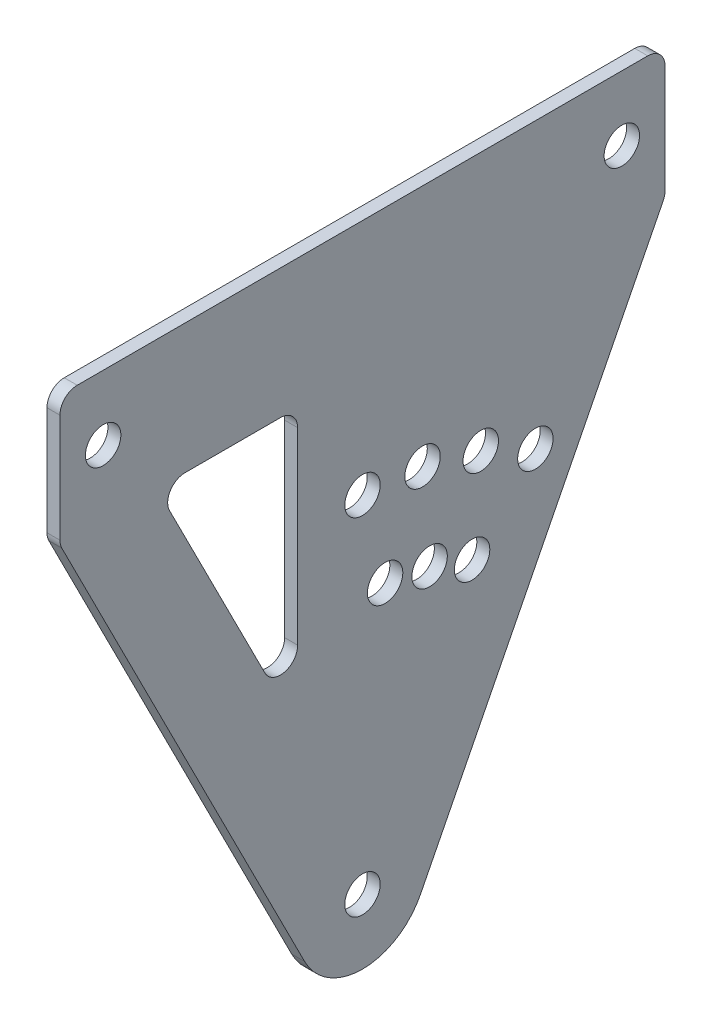
ISO-10303-21;
HEADER;
FILE_DESCRIPTION(('STEP AP214'),'2;1');
FILE_NAME('part.step','',(''),(''),'','','');
FILE_SCHEMA(('AUTOMOTIVE_DESIGN { 1 0 10303 214 1 1 1 1 }'));
ENDSEC;
DATA;
#1=APPLICATION_CONTEXT('core data for automotive mechanical design processes');
#2=APPLICATION_PROTOCOL_DEFINITION('international standard','automotive_design',2000,#1);
#3=PRODUCT_CONTEXT('',#1,'mechanical');
#4=PRODUCT('Part','Part','',(#3));
#5=PRODUCT_RELATED_PRODUCT_CATEGORY('part','',(#4));
#6=PRODUCT_DEFINITION_FORMATION('','',#4);
#7=PRODUCT_DEFINITION_CONTEXT('part definition',#1,'design');
#8=PRODUCT_DEFINITION('design','',#6,#7);
#9=PRODUCT_DEFINITION_SHAPE('','',#8);
#10=(LENGTH_UNIT() NAMED_UNIT(*) SI_UNIT(.MILLI.,.METRE.));
#11=(NAMED_UNIT(*) PLANE_ANGLE_UNIT() SI_UNIT($,.RADIAN.));
#12=(NAMED_UNIT(*) SI_UNIT($,.STERADIAN.) SOLID_ANGLE_UNIT());
#13=UNCERTAINTY_MEASURE_WITH_UNIT(LENGTH_MEASURE(1.E-05),#10,'distance_accuracy_value','');
#14=(GEOMETRIC_REPRESENTATION_CONTEXT(3) GLOBAL_UNCERTAINTY_ASSIGNED_CONTEXT((#13)) GLOBAL_UNIT_ASSIGNED_CONTEXT((#10,
#11,#12)) REPRESENTATION_CONTEXT('',''));
#15=CARTESIAN_POINT('',(0.,0.,0.));
#16=DIRECTION('',(0.,0.,1.));
#17=DIRECTION('',(1.,0.,0.));
#18=AXIS2_PLACEMENT_3D('',#15,#16,#17);
#19=CARTESIAN_POINT('',(1.5,-3.38899914927747,6.69064158105906));
#20=DIRECTION('',(0.,0.451866553236997,-0.892085544141209));
#21=DIRECTION('',(0.,0.892085544141209,0.451866553236997));
#22=AXIS2_PLACEMENT_3D('',#19,#20,#21);
#23=PLANE('',#22);
#24=DIRECTION('',(0.,-0.892085544141209,-0.451866553236997));
#25=VECTOR('',#24,1.);
#26=CARTESIAN_POINT('',(1.5,-3.38899914927747,6.69064158105906));
#27=LINE('',#26,#25);
#28=CARTESIAN_POINT('',(1.5,52.0739055020299,34.7841710882824));
#29=VERTEX_POINT('',#28);
#30=CARTESIAN_POINT('',(1.5,-3.38899914927747,6.69064158105906));
#31=VERTEX_POINT('',#30);
#32=EDGE_CURVE('E156',#29,#31,#27,.T.);
#33=ORIENTED_EDGE('',*,*,#32,.F.);
#34=DIRECTION('',(-1.,0.,0.));
#35=VECTOR('',#34,1.);
#36=CARTESIAN_POINT('',(1.5,52.0739055020299,34.7841710882824));
#37=LINE('',#36,#35);
#38=CARTESIAN_POINT('',(0.,52.0739055020299,34.7841710882824));
#39=VERTEX_POINT('',#38);
#40=EDGE_CURVE('E388',#29,#39,#37,.T.);
#41=ORIENTED_EDGE('',*,*,#40,.T.);
#42=DIRECTION('',(0.,-0.892085544141209,-0.451866553236997));
#43=VECTOR('',#42,1.);
#44=CARTESIAN_POINT('',(0.,-3.38899914927747,6.69064158105906));
#45=LINE('',#44,#43);
#46=CARTESIAN_POINT('',(0.,-3.38899914927747,6.69064158105906));
#47=VERTEX_POINT('',#46);
#48=EDGE_CURVE('E183',#39,#47,#45,.T.);
#49=ORIENTED_EDGE('',*,*,#48,.T.);
#50=DIRECTION('',(-1.,0.,0.));
#51=VECTOR('',#50,1.);
#52=CARTESIAN_POINT('',(1.5,-3.38899914927747,6.69064158105906));
#53=LINE('',#52,#51);
#54=EDGE_CURVE('E176',#31,#47,#53,.T.);
#55=ORIENTED_EDGE('',*,*,#54,.F.);
#56=EDGE_LOOP('',(#33,#41,#49,#55));
#57=FACE_BOUND('',#56,.T.);
#58=ADVANCED_FACE('F42',(#57),#23,.F.);
#59=CARTESIAN_POINT('',(1.5,0.,0.));
#60=DIRECTION('',(-1.,0.,0.));
#61=DIRECTION('',(0.,0.,1.));
#62=AXIS2_PLACEMENT_3D('',#59,#60,#61);
#63=CYLINDRICAL_SURFACE('',#62,7.49999999999999);
#64=CARTESIAN_POINT('',(0.,0.,0.));
#65=DIRECTION('',(1.,0.,0.));
#66=DIRECTION('',(0.,0.,-1.));
#67=AXIS2_PLACEMENT_3D('',#64,#65,#66);
#68=CIRCLE('',#67,7.49999999999999);
#69=CARTESIAN_POINT('',(0.,-3.38899914927747,-6.69064158105906));
#70=VERTEX_POINT('',#69);
#71=EDGE_CURVE('E281',#47,#70,#68,.T.);
#72=ORIENTED_EDGE('',*,*,#71,.T.);
#73=DIRECTION('',(-1.,0.,0.));
#74=VECTOR('',#73,1.);
#75=CARTESIAN_POINT('',(1.5,-3.38899914927747,-6.69064158105906));
#76=LINE('',#75,#74);
#77=CARTESIAN_POINT('',(1.5,-3.38899914927747,-6.69064158105906));
#78=VERTEX_POINT('',#77);
#79=EDGE_CURVE('E178',#78,#70,#76,.T.);
#80=ORIENTED_EDGE('',*,*,#79,.F.);
#81=CARTESIAN_POINT('',(1.5,0.,0.));
#82=DIRECTION('',(1.,0.,0.));
#83=DIRECTION('',(0.,0.,-1.));
#84=AXIS2_PLACEMENT_3D('',#81,#82,#83);
#85=CIRCLE('',#84,7.49999999999999);
#86=EDGE_CURVE('E161',#31,#78,#85,.T.);
#87=ORIENTED_EDGE('',*,*,#86,.F.);
#88=ORIENTED_EDGE('',*,*,#54,.T.);
#89=EDGE_LOOP('',(#72,#80,#87,#88));
#90=FACE_BOUND('',#89,.T.);
#91=ADVANCED_FACE('F175',(#90),#63,.T.);
#92=CARTESIAN_POINT('',(1.5,-3.38899914927747,-6.69064158105906));
#93=DIRECTION('',(0.,-0.451866553236997,-0.892085544141209));
#94=DIRECTION('',(0.,0.892085544141209,-0.451866553236997));
#95=AXIS2_PLACEMENT_3D('',#92,#93,#94);
#96=PLANE('',#95);
#97=DIRECTION('',(0.,-0.892085544141209,0.451866553236997));
#98=VECTOR('',#97,1.);
#99=CARTESIAN_POINT('',(0.,-3.38899914927747,-6.69064158105906));
#100=LINE('',#99,#98);
#101=CARTESIAN_POINT('',(0.,52.0739055020299,-34.7841710882824));
#102=VERTEX_POINT('',#101);
#103=EDGE_CURVE('E283',#102,#70,#100,.T.);
#104=ORIENTED_EDGE('',*,*,#103,.F.);
#105=DIRECTION('',(-1.,0.,0.));
#106=VECTOR('',#105,1.);
#107=CARTESIAN_POINT('',(1.5,52.0739055020299,-34.7841710882824));
#108=LINE('',#107,#106);
#109=CARTESIAN_POINT('',(1.5,52.0739055020299,-34.7841710882824));
#110=VERTEX_POINT('',#109);
#111=EDGE_CURVE('E384',#102,#110,#108,.F.);
#112=ORIENTED_EDGE('',*,*,#111,.T.);
#113=DIRECTION('',(0.,-0.892085544141209,0.451866553236997));
#114=VECTOR('',#113,1.);
#115=CARTESIAN_POINT('',(1.5,-3.38899914927747,-6.69064158105906));
#116=LINE('',#115,#114);
#117=EDGE_CURVE('E180',#110,#78,#116,.T.);
#118=ORIENTED_EDGE('',*,*,#117,.T.);
#119=ORIENTED_EDGE('',*,*,#79,.T.);
#120=EDGE_LOOP('',(#104,#112,#118,#119));
#121=FACE_BOUND('',#120,.T.);
#122=ADVANCED_FACE('F448',(#121),#96,.T.);
#123=CARTESIAN_POINT('',(1.5,0.,-35.));
#124=DIRECTION('',(0.,0.,-1.));
#125=DIRECTION('',(-1.,0.,0.));
#126=AXIS2_PLACEMENT_3D('',#123,#124,#125);
#127=PLANE('',#126);
#128=DIRECTION('',(0.,-1.,0.));
#129=VECTOR('',#128,1.);
#130=CARTESIAN_POINT('',(0.,0.,-35.));
#131=LINE('',#130,#129);
#132=CARTESIAN_POINT('',(0.,65.5,-35.));
#133=VERTEX_POINT('',#132);
#134=CARTESIAN_POINT('',(0.,52.9776386085039,-35.));
#135=VERTEX_POINT('',#134);
#136=EDGE_CURVE('E285',#133,#135,#131,.T.);
#137=ORIENTED_EDGE('',*,*,#136,.F.);
#138=DIRECTION('',(-1.,0.,0.));
#139=VECTOR('',#138,1.);
#140=CARTESIAN_POINT('',(1.5,65.5,-35.));
#141=LINE('',#140,#139);
#142=CARTESIAN_POINT('',(1.5,65.5,-35.));
#143=VERTEX_POINT('',#142);
#144=EDGE_CURVE('E221',#133,#143,#141,.F.);
#145=ORIENTED_EDGE('',*,*,#144,.T.);
#146=DIRECTION('',(0.,-1.,0.));
#147=VECTOR('',#146,1.);
#148=CARTESIAN_POINT('',(1.5,0.,-35.));
#149=LINE('',#148,#147);
#150=CARTESIAN_POINT('',(1.5,52.9776386085039,-35.));
#151=VERTEX_POINT('',#150);
#152=EDGE_CURVE('E375',#143,#151,#149,.T.);
#153=ORIENTED_EDGE('',*,*,#152,.T.);
#154=DIRECTION('',(-1.,0.,0.));
#155=VECTOR('',#154,1.);
#156=CARTESIAN_POINT('',(1.5,52.9776386085039,-35.));
#157=LINE('',#156,#155);
#158=EDGE_CURVE('E218',#151,#135,#157,.T.);
#159=ORIENTED_EDGE('',*,*,#158,.T.);
#160=EDGE_LOOP('',(#137,#145,#153,#159));
#161=FACE_BOUND('',#160,.T.);
#162=ADVANCED_FACE('F439',(#161),#127,.T.);
#163=CARTESIAN_POINT('',(1.5,67.5,0.));
#164=DIRECTION('',(0.,1.,0.));
#165=DIRECTION('',(0.,0.,1.));
#166=AXIS2_PLACEMENT_3D('',#163,#164,#165);
#167=PLANE('',#166);
#168=DIRECTION('',(0.,0.,-1.));
#169=VECTOR('',#168,1.);
#170=CARTESIAN_POINT('',(1.5,67.5,0.));
#171=LINE('',#170,#169);
#172=CARTESIAN_POINT('',(1.5,67.5,33.));
#173=VERTEX_POINT('',#172);
#174=CARTESIAN_POINT('',(1.5,67.5,-33.));
#175=VERTEX_POINT('',#174);
#176=EDGE_CURVE('E238',#173,#175,#171,.T.);
#177=ORIENTED_EDGE('',*,*,#176,.T.);
#178=DIRECTION('',(-1.,0.,0.));
#179=VECTOR('',#178,1.);
#180=CARTESIAN_POINT('',(1.5,67.5,-33.));
#181=LINE('',#180,#179);
#182=CARTESIAN_POINT('',(0.,67.5,-33.));
#183=VERTEX_POINT('',#182);
#184=EDGE_CURVE('E207',#175,#183,#181,.T.);
#185=ORIENTED_EDGE('',*,*,#184,.T.);
#186=DIRECTION('',(0.,0.,-1.));
#187=VECTOR('',#186,1.);
#188=CARTESIAN_POINT('',(0.,67.5,0.));
#189=LINE('',#188,#187);
#190=CARTESIAN_POINT('',(0.,67.5,33.));
#191=VERTEX_POINT('',#190);
#192=EDGE_CURVE('E288',#191,#183,#189,.T.);
#193=ORIENTED_EDGE('',*,*,#192,.F.);
#194=DIRECTION('',(-1.,0.,0.));
#195=VECTOR('',#194,1.);
#196=CARTESIAN_POINT('',(1.5,67.5,33.));
#197=LINE('',#196,#195);
#198=EDGE_CURVE('E205',#191,#173,#197,.F.);
#199=ORIENTED_EDGE('',*,*,#198,.T.);
#200=EDGE_LOOP('',(#177,#185,#193,#199));
#201=FACE_BOUND('',#200,.T.);
#202=ADVANCED_FACE('F431',(#201),#167,.T.);
#203=CARTESIAN_POINT('',(1.5,52.5,0.));
#204=DIRECTION('',(0.,-1.,0.));
#205=DIRECTION('',(0.,0.,-1.));
#206=AXIS2_PLACEMENT_3D('',#203,#204,#205);
#207=PLANE('',#206);
#208=DIRECTION('',(0.,0.,1.));
#209=VECTOR('',#208,1.);
#210=CARTESIAN_POINT('',(0.,52.5,0.));
#211=LINE('',#210,#209);
#212=CARTESIAN_POINT('',(0.,52.5,9.5));
#213=VERTEX_POINT('',#212);
#214=CARTESIAN_POINT('',(0.,52.5,20.535318679672));
#215=VERTEX_POINT('',#214);
#216=EDGE_CURVE('E241',#213,#215,#211,.T.);
#217=ORIENTED_EDGE('',*,*,#216,.F.);
#218=DIRECTION('',(-1.,0.,0.));
#219=VECTOR('',#218,1.);
#220=CARTESIAN_POINT('',(1.5,52.5,9.5));
#221=LINE('',#220,#219);
#222=CARTESIAN_POINT('',(1.5,52.5,9.5));
#223=VERTEX_POINT('',#222);
#224=EDGE_CURVE('E198',#213,#223,#221,.F.);
#225=ORIENTED_EDGE('',*,*,#224,.T.);
#226=DIRECTION('',(0.,0.,1.));
#227=VECTOR('',#226,1.);
#228=CARTESIAN_POINT('',(1.5,52.5,0.));
#229=LINE('',#228,#227);
#230=CARTESIAN_POINT('',(1.5,52.5,20.535318679672));
#231=VERTEX_POINT('',#230);
#232=EDGE_CURVE('E291',#223,#231,#229,.T.);
#233=ORIENTED_EDGE('',*,*,#232,.T.);
#234=DIRECTION('',(-1.,0.,0.));
#235=VECTOR('',#234,1.);
#236=CARTESIAN_POINT('',(0.,52.5,20.535318679672));
#237=LINE('',#236,#235);
#238=EDGE_CURVE('E195',#231,#215,#237,.T.);
#239=ORIENTED_EDGE('',*,*,#238,.T.);
#240=EDGE_LOOP('',(#217,#225,#233,#239));
#241=FACE_BOUND('',#240,.T.);
#242=ADVANCED_FACE('F429',(#241),#207,.T.);
#243=CARTESIAN_POINT('',(1.5,0.,7.49999999999998));
#244=DIRECTION('',(0.,0.,-1.));
#245=DIRECTION('',(0.,1.,0.));
#246=AXIS2_PLACEMENT_3D('',#243,#244,#245);
#247=PLANE('',#246);
#248=DIRECTION('',(0.,-1.,0.));
#249=VECTOR('',#248,1.);
#250=CARTESIAN_POINT('',(1.5,0.,7.49999999999998));
#251=LINE('',#250,#249);
#252=CARTESIAN_POINT('',(1.5,50.5,7.5));
#253=VERTEX_POINT('',#252);
#254=CARTESIAN_POINT('',(1.5,28.7138151217322,7.49999999999999));
#255=VERTEX_POINT('',#254);
#256=EDGE_CURVE('E296',#253,#255,#251,.T.);
#257=ORIENTED_EDGE('',*,*,#256,.F.);
#258=DIRECTION('',(-1.,0.,0.));
#259=VECTOR('',#258,1.);
#260=CARTESIAN_POINT('',(1.5,50.5,7.5));
#261=LINE('',#260,#259);
#262=CARTESIAN_POINT('',(0.,50.5,7.5));
#263=VERTEX_POINT('',#262);
#264=EDGE_CURVE('E187',#253,#263,#261,.T.);
#265=ORIENTED_EDGE('',*,*,#264,.T.);
#266=DIRECTION('',(0.,-1.,0.));
#267=VECTOR('',#266,1.);
#268=CARTESIAN_POINT('',(0.,0.,7.49999999999998));
#269=LINE('',#268,#267);
#270=CARTESIAN_POINT('',(0.,28.7138151217322,7.49999999999999));
#271=VERTEX_POINT('',#270);
#272=EDGE_CURVE('E244',#263,#271,#269,.T.);
#273=ORIENTED_EDGE('',*,*,#272,.T.);
#274=DIRECTION('',(-1.,0.,0.));
#275=VECTOR('',#274,1.);
#276=CARTESIAN_POINT('',(1.5,28.7138151217322,7.49999999999999));
#277=LINE('',#276,#275);
#278=EDGE_CURVE('E185',#271,#255,#277,.F.);
#279=ORIENTED_EDGE('',*,*,#278,.T.);
#280=EDGE_LOOP('',(#257,#265,#273,#279));
#281=FACE_BOUND('',#280,.T.);
#282=ADVANCED_FACE('F424',(#281),#247,.F.);
#283=CARTESIAN_POINT('',(1.5,0.,0.));
#284=DIRECTION('',(-1.,0.,0.));
#285=DIRECTION('',(0.,0.,1.));
#286=AXIS2_PLACEMENT_3D('',#283,#284,#285);
#287=CYLINDRICAL_SURFACE('',#286,2.05);
#288=CARTESIAN_POINT('',(1.5,0.,0.));
#289=DIRECTION('',(1.,0.,0.));
#290=DIRECTION('',(0.,0.,-1.));
#291=AXIS2_PLACEMENT_3D('',#288,#289,#290);
#292=CIRCLE('',#291,2.05);
#293=CARTESIAN_POINT('',(1.5,0.,-2.05));
#294=VERTEX_POINT('',#293);
#295=EDGE_CURVE('E170',#294,#294,#292,.T.);
#296=ORIENTED_EDGE('',*,*,#295,.T.);
#297=EDGE_LOOP('',(#296));
#298=FACE_BOUND('',#297,.T.);
#299=CARTESIAN_POINT('',(0.,0.,0.));
#300=DIRECTION('',(1.,0.,0.));
#301=DIRECTION('',(0.,0.,-1.));
#302=AXIS2_PLACEMENT_3D('',#299,#300,#301);
#303=CIRCLE('',#302,2.05);
#304=CARTESIAN_POINT('',(0.,0.,-2.05));
#305=VERTEX_POINT('',#304);
#306=EDGE_CURVE('E277',#305,#305,#303,.T.);
#307=ORIENTED_EDGE('',*,*,#306,.F.);
#308=EDGE_LOOP('',(#307));
#309=FACE_BOUND('',#308,.T.);
#310=ADVANCED_FACE('F437',(#298,#309),#287,.F.);
#311=CARTESIAN_POINT('',(1.5,40.,0.));
#312=DIRECTION('',(-1.,0.,0.));
#313=DIRECTION('',(0.,0.,1.));
#314=AXIS2_PLACEMENT_3D('',#311,#312,#313);
#315=CYLINDRICAL_SURFACE('',#314,2.05);
#316=CARTESIAN_POINT('',(1.5,40.,0.));
#317=DIRECTION('',(1.,0.,0.));
#318=DIRECTION('',(0.,0.,-1.));
#319=AXIS2_PLACEMENT_3D('',#316,#317,#318);
#320=CIRCLE('',#319,2.05);
#321=CARTESIAN_POINT('',(1.5,40.,-2.05));
#322=VERTEX_POINT('',#321);
#323=EDGE_CURVE('E362',#322,#322,#320,.T.);
#324=ORIENTED_EDGE('',*,*,#323,.T.);
#325=EDGE_LOOP('',(#324));
#326=FACE_BOUND('',#325,.T.);
#327=CARTESIAN_POINT('',(0.,40.,0.));
#328=DIRECTION('',(1.,0.,0.));
#329=DIRECTION('',(0.,0.,-1.));
#330=AXIS2_PLACEMENT_3D('',#327,#328,#329);
#331=CIRCLE('',#330,2.05);
#332=CARTESIAN_POINT('',(0.,40.,-2.05));
#333=VERTEX_POINT('',#332);
#334=EDGE_CURVE('E274',#333,#333,#331,.T.);
#335=ORIENTED_EDGE('',*,*,#334,.F.);
#336=EDGE_LOOP('',(#335));
#337=FACE_BOUND('',#336,.T.);
#338=ADVANCED_FACE('F454',(#326,#337),#315,.F.);
#339=CARTESIAN_POINT('',(1.5,39.3923101204883,-6.94592710667722));
#340=DIRECTION('',(-1.,0.,0.));
#341=DIRECTION('',(0.,0.,1.));
#342=AXIS2_PLACEMENT_3D('',#339,#340,#341);
#343=CYLINDRICAL_SURFACE('',#342,2.05000000000001);
#344=CARTESIAN_POINT('',(1.5,39.3923101204883,-6.94592710667722));
#345=DIRECTION('',(1.,0.,0.));
#346=DIRECTION('',(0.,0.,-1.));
#347=AXIS2_PLACEMENT_3D('',#344,#345,#346);
#348=CIRCLE('',#347,2.05000000000001);
#349=CARTESIAN_POINT('',(1.5,39.3923101204883,-8.99592710667723));
#350=VERTEX_POINT('',#349);
#351=EDGE_CURVE('E354',#350,#350,#348,.T.);
#352=ORIENTED_EDGE('',*,*,#351,.T.);
#353=EDGE_LOOP('',(#352));
#354=FACE_BOUND('',#353,.T.);
#355=CARTESIAN_POINT('',(0.,39.3923101204883,-6.94592710667722));
#356=DIRECTION('',(1.,0.,0.));
#357=DIRECTION('',(0.,0.,-1.));
#358=AXIS2_PLACEMENT_3D('',#355,#356,#357);
#359=CIRCLE('',#358,2.05000000000001);
#360=CARTESIAN_POINT('',(0.,39.3923101204883,-8.99592710667723));
#361=VERTEX_POINT('',#360);
#362=EDGE_CURVE('E271',#361,#361,#359,.T.);
#363=ORIENTED_EDGE('',*,*,#362,.F.);
#364=EDGE_LOOP('',(#363));
#365=FACE_BOUND('',#364,.T.);
#366=ADVANCED_FACE('F458',(#354,#365),#343,.F.);
#367=CARTESIAN_POINT('',(1.5,37.5877048314363,-13.6808057330268));
#368=DIRECTION('',(-1.,0.,0.));
#369=DIRECTION('',(0.,0.,1.));
#370=AXIS2_PLACEMENT_3D('',#367,#368,#369);
#371=CYLINDRICAL_SURFACE('',#370,2.05);
#372=CARTESIAN_POINT('',(1.5,37.5877048314363,-13.6808057330268));
#373=DIRECTION('',(1.,0.,0.));
#374=DIRECTION('',(0.,0.,-1.));
#375=AXIS2_PLACEMENT_3D('',#372,#373,#374);
#376=CIRCLE('',#375,2.05);
#377=CARTESIAN_POINT('',(1.5,37.5877048314363,-15.7308057330268));
#378=VERTEX_POINT('',#377);
#379=EDGE_CURVE('E349',#378,#378,#376,.T.);
#380=ORIENTED_EDGE('',*,*,#379,.T.);
#381=EDGE_LOOP('',(#380));
#382=FACE_BOUND('',#381,.T.);
#383=CARTESIAN_POINT('',(0.,37.5877048314363,-13.6808057330268));
#384=DIRECTION('',(1.,0.,0.));
#385=DIRECTION('',(0.,0.,-1.));
#386=AXIS2_PLACEMENT_3D('',#383,#384,#385);
#387=CIRCLE('',#386,2.05);
#388=CARTESIAN_POINT('',(0.,37.5877048314363,-15.7308057330268));
#389=VERTEX_POINT('',#388);
#390=EDGE_CURVE('E268',#389,#389,#387,.T.);
#391=ORIENTED_EDGE('',*,*,#390,.F.);
#392=EDGE_LOOP('',(#391));
#393=FACE_BOUND('',#392,.T.);
#394=ADVANCED_FACE('F462',(#382,#393),#371,.F.);
#395=CARTESIAN_POINT('',(1.5,34.6410161513775,-20.));
#396=DIRECTION('',(-1.,0.,0.));
#397=DIRECTION('',(0.,0.,1.));
#398=AXIS2_PLACEMENT_3D('',#395,#396,#397);
#399=CYLINDRICAL_SURFACE('',#398,2.05);
#400=CARTESIAN_POINT('',(1.5,34.6410161513775,-20.));
#401=DIRECTION('',(1.,0.,0.));
#402=DIRECTION('',(0.,0.,-1.));
#403=AXIS2_PLACEMENT_3D('',#400,#401,#402);
#404=CIRCLE('',#403,2.05);
#405=CARTESIAN_POINT('',(1.5,34.6410161513775,-22.05));
#406=VERTEX_POINT('',#405);
#407=EDGE_CURVE('E344',#406,#406,#404,.T.);
#408=ORIENTED_EDGE('',*,*,#407,.T.);
#409=EDGE_LOOP('',(#408));
#410=FACE_BOUND('',#409,.T.);
#411=CARTESIAN_POINT('',(0.,34.6410161513775,-20.));
#412=DIRECTION('',(1.,0.,0.));
#413=DIRECTION('',(0.,0.,-1.));
#414=AXIS2_PLACEMENT_3D('',#411,#412,#413);
#415=CIRCLE('',#414,2.05);
#416=CARTESIAN_POINT('',(0.,34.6410161513775,-22.05));
#417=VERTEX_POINT('',#416);
#418=EDGE_CURVE('E265',#417,#417,#415,.T.);
#419=ORIENTED_EDGE('',*,*,#418,.F.);
#420=EDGE_LOOP('',(#419));
#421=FACE_BOUND('',#420,.T.);
#422=ADVANCED_FACE('F466',(#410,#421),#399,.F.);
#423=CARTESIAN_POINT('',(1.5,29.8858409427524,-2.61467228242975));
#424=DIRECTION('',(-1.,0.,0.));
#425=DIRECTION('',(0.,0.,1.));
#426=AXIS2_PLACEMENT_3D('',#423,#424,#425);
#427=CYLINDRICAL_SURFACE('',#426,2.05);
#428=CARTESIAN_POINT('',(1.5,29.8858409427524,-2.61467228242975));
#429=DIRECTION('',(1.,0.,0.));
#430=DIRECTION('',(0.,0.,-1.));
#431=AXIS2_PLACEMENT_3D('',#428,#429,#430);
#432=CIRCLE('',#431,2.05);
#433=CARTESIAN_POINT('',(1.5,29.8858409427524,-4.66467228242975));
#434=VERTEX_POINT('',#433);
#435=EDGE_CURVE('E340',#434,#434,#432,.T.);
#436=ORIENTED_EDGE('',*,*,#435,.T.);
#437=EDGE_LOOP('',(#436));
#438=FACE_BOUND('',#437,.T.);
#439=CARTESIAN_POINT('',(0.,29.8858409427524,-2.61467228242975));
#440=DIRECTION('',(1.,0.,0.));
#441=DIRECTION('',(0.,0.,-1.));
#442=AXIS2_PLACEMENT_3D('',#439,#440,#441);
#443=CIRCLE('',#442,2.05);
#444=CARTESIAN_POINT('',(0.,29.8858409427524,-4.66467228242975));
#445=VERTEX_POINT('',#444);
#446=EDGE_CURVE('E262',#445,#445,#443,.T.);
#447=ORIENTED_EDGE('',*,*,#446,.F.);
#448=EDGE_LOOP('',(#447));
#449=FACE_BOUND('',#448,.T.);
#450=ADVANCED_FACE('F470',(#438,#449),#427,.F.);
#451=CARTESIAN_POINT('',(1.5,28.977774788672,-7.76457135307567));
#452=DIRECTION('',(-1.,0.,0.));
#453=DIRECTION('',(0.,0.,1.));
#454=AXIS2_PLACEMENT_3D('',#451,#452,#453);
#455=CYLINDRICAL_SURFACE('',#454,2.05);
#456=CARTESIAN_POINT('',(1.5,28.977774788672,-7.76457135307567));
#457=DIRECTION('',(1.,0.,0.));
#458=DIRECTION('',(0.,0.,-1.));
#459=AXIS2_PLACEMENT_3D('',#456,#457,#458);
#460=CIRCLE('',#459,2.05);
#461=CARTESIAN_POINT('',(1.5,28.977774788672,-9.81457135307567));
#462=VERTEX_POINT('',#461);
#463=EDGE_CURVE('E332',#462,#462,#460,.T.);
#464=ORIENTED_EDGE('',*,*,#463,.T.);
#465=EDGE_LOOP('',(#464));
#466=FACE_BOUND('',#465,.T.);
#467=CARTESIAN_POINT('',(0.,28.977774788672,-7.76457135307567));
#468=DIRECTION('',(1.,0.,0.));
#469=DIRECTION('',(0.,0.,-1.));
#470=AXIS2_PLACEMENT_3D('',#467,#468,#469);
#471=CIRCLE('',#470,2.05);
#472=CARTESIAN_POINT('',(0.,28.977774788672,-9.81457135307567));
#473=VERTEX_POINT('',#472);
#474=EDGE_CURVE('E259',#473,#473,#471,.T.);
#475=ORIENTED_EDGE('',*,*,#474,.F.);
#476=EDGE_LOOP('',(#475));
#477=FACE_BOUND('',#476,.T.);
#478=ADVANCED_FACE('F474',(#466,#477),#455,.F.);
#479=CARTESIAN_POINT('',(1.5,27.1892336110995,-12.6785478522211));
#480=DIRECTION('',(-1.,0.,0.));
#481=DIRECTION('',(0.,0.,1.));
#482=AXIS2_PLACEMENT_3D('',#479,#480,#481);
#483=CYLINDRICAL_SURFACE('',#482,2.05);
#484=CARTESIAN_POINT('',(1.5,27.1892336110995,-12.6785478522211));
#485=DIRECTION('',(1.,0.,0.));
#486=DIRECTION('',(0.,0.,-1.));
#487=AXIS2_PLACEMENT_3D('',#484,#485,#486);
#488=CIRCLE('',#487,2.05);
#489=CARTESIAN_POINT('',(1.5,27.1892336110995,-14.7285478522211));
#490=VERTEX_POINT('',#489);
#491=EDGE_CURVE('E327',#490,#490,#488,.T.);
#492=ORIENTED_EDGE('',*,*,#491,.T.);
#493=EDGE_LOOP('',(#492));
#494=FACE_BOUND('',#493,.T.);
#495=CARTESIAN_POINT('',(0.,27.1892336110995,-12.6785478522211));
#496=DIRECTION('',(1.,0.,0.));
#497=DIRECTION('',(0.,0.,-1.));
#498=AXIS2_PLACEMENT_3D('',#495,#496,#497);
#499=CIRCLE('',#498,2.05);
#500=CARTESIAN_POINT('',(0.,27.1892336110995,-14.7285478522211));
#501=VERTEX_POINT('',#500);
#502=EDGE_CURVE('E256',#501,#501,#499,.T.);
#503=ORIENTED_EDGE('',*,*,#502,.F.);
#504=EDGE_LOOP('',(#503));
#505=FACE_BOUND('',#504,.T.);
#506=ADVANCED_FACE('F478',(#494,#505),#483,.F.);
#507=CARTESIAN_POINT('',(1.5,60.,30.));
#508=DIRECTION('',(-1.,0.,0.));
#509=DIRECTION('',(0.,0.,1.));
#510=AXIS2_PLACEMENT_3D('',#507,#508,#509);
#511=CYLINDRICAL_SURFACE('',#510,2.05);
#512=CARTESIAN_POINT('',(1.5,60.,30.));
#513=DIRECTION('',(1.,0.,0.));
#514=DIRECTION('',(0.,0.,-1.));
#515=AXIS2_PLACEMENT_3D('',#512,#513,#514);
#516=CIRCLE('',#515,2.05);
#517=CARTESIAN_POINT('',(1.5,60.,27.95));
#518=VERTEX_POINT('',#517);
#519=EDGE_CURVE('E322',#518,#518,#516,.T.);
#520=ORIENTED_EDGE('',*,*,#519,.T.);
#521=EDGE_LOOP('',(#520));
#522=FACE_BOUND('',#521,.T.);
#523=CARTESIAN_POINT('',(0.,60.,30.));
#524=DIRECTION('',(1.,0.,0.));
#525=DIRECTION('',(0.,0.,-1.));
#526=AXIS2_PLACEMENT_3D('',#523,#524,#525);
#527=CIRCLE('',#526,2.05);
#528=CARTESIAN_POINT('',(0.,60.,27.95));
#529=VERTEX_POINT('',#528);
#530=EDGE_CURVE('E253',#529,#529,#527,.T.);
#531=ORIENTED_EDGE('',*,*,#530,.F.);
#532=EDGE_LOOP('',(#531));
#533=FACE_BOUND('',#532,.T.);
#534=ADVANCED_FACE('F482',(#522,#533),#511,.F.);
#535=CARTESIAN_POINT('',(1.5,60.,-30.));
#536=DIRECTION('',(-1.,0.,0.));
#537=DIRECTION('',(0.,0.,1.));
#538=AXIS2_PLACEMENT_3D('',#535,#536,#537);
#539=CYLINDRICAL_SURFACE('',#538,2.05);
#540=CARTESIAN_POINT('',(1.5,60.,-30.));
#541=DIRECTION('',(1.,0.,0.));
#542=DIRECTION('',(0.,0.,-1.));
#543=AXIS2_PLACEMENT_3D('',#540,#541,#542);
#544=CIRCLE('',#543,2.05);
#545=CARTESIAN_POINT('',(1.5,60.,-32.05));
#546=VERTEX_POINT('',#545);
#547=EDGE_CURVE('E319',#546,#546,#544,.F.);
#548=ORIENTED_EDGE('',*,*,#547,.F.);
#549=EDGE_LOOP('',(#548));
#550=FACE_BOUND('',#549,.T.);
#551=CARTESIAN_POINT('',(0.,60.,-30.));
#552=DIRECTION('',(1.,0.,0.));
#553=DIRECTION('',(0.,0.,-1.));
#554=AXIS2_PLACEMENT_3D('',#551,#552,#553);
#555=CIRCLE('',#554,2.05);
#556=CARTESIAN_POINT('',(0.,60.,-32.05));
#557=VERTEX_POINT('',#556);
#558=EDGE_CURVE('E250',#557,#557,#555,.F.);
#559=ORIENTED_EDGE('',*,*,#558,.T.);
#560=EDGE_LOOP('',(#559));
#561=FACE_BOUND('',#560,.T.);
#562=ADVANCED_FACE('F486',(#550,#561),#539,.F.);
#563=CARTESIAN_POINT('',(1.5,1.12966638309249,-2.23021386035302));
#564=DIRECTION('',(0.,0.451866553236997,-0.892085544141209));
#565=DIRECTION('',(0.,0.892085544141209,0.451866553236997));
#566=AXIS2_PLACEMENT_3D('',#563,#564,#565);
#567=PLANE('',#566);
#568=DIRECTION('',(0.,-0.892085544141209,-0.451866553236997));
#569=VECTOR('',#568,1.);
#570=CARTESIAN_POINT('',(1.5,1.12966638309249,-2.23021386035302));
#571=LINE('',#570,#569);
#572=CARTESIAN_POINT('',(1.5,49.596266893526,22.3194897679544));
#573=VERTEX_POINT('',#572);
#574=CARTESIAN_POINT('',(1.5,27.8100820152582,11.2841710882824));
#575=VERTEX_POINT('',#574);
#576=EDGE_CURVE('E304',#573,#575,#571,.T.);
#577=ORIENTED_EDGE('',*,*,#576,.T.);
#578=DIRECTION('',(-1.,0.,0.));
#579=VECTOR('',#578,1.);
#580=CARTESIAN_POINT('',(1.5,27.8100820152582,11.2841710882824));
#581=LINE('',#580,#579);
#582=CARTESIAN_POINT('',(0.,27.8100820152582,11.2841710882824));
#583=VERTEX_POINT('',#582);
#584=EDGE_CURVE('E202',#575,#583,#581,.T.);
#585=ORIENTED_EDGE('',*,*,#584,.T.);
#586=DIRECTION('',(0.,-0.892085544141209,-0.451866553236997));
#587=VECTOR('',#586,1.);
#588=CARTESIAN_POINT('',(0.,1.12966638309249,-2.23021386035302));
#589=LINE('',#588,#587);
#590=CARTESIAN_POINT('',(0.,49.596266893526,22.3194897679544));
#591=VERTEX_POINT('',#590);
#592=EDGE_CURVE('E247',#591,#583,#589,.T.);
#593=ORIENTED_EDGE('',*,*,#592,.F.);
#594=DIRECTION('',(-1.,0.,0.));
#595=VECTOR('',#594,1.);
#596=CARTESIAN_POINT('',(1.5,49.596266893526,22.3194897679544));
#597=LINE('',#596,#595);
#598=EDGE_CURVE('E200',#591,#573,#597,.F.);
#599=ORIENTED_EDGE('',*,*,#598,.T.);
#600=EDGE_LOOP('',(#577,#585,#593,#599));
#601=FACE_BOUND('',#600,.T.);
#602=ADVANCED_FACE('F410',(#601),#567,.T.);
#603=CARTESIAN_POINT('',(1.5,0.,35.));
#604=DIRECTION('',(0.,0.,-1.));
#605=DIRECTION('',(-1.,0.,0.));
#606=AXIS2_PLACEMENT_3D('',#603,#604,#605);
#607=PLANE('',#606);
#608=DIRECTION('',(0.,-1.,0.));
#609=VECTOR('',#608,1.);
#610=CARTESIAN_POINT('',(0.,0.,35.));
#611=LINE('',#610,#609);
#612=CARTESIAN_POINT('',(0.,65.5,35.));
#613=VERTEX_POINT('',#612);
#614=CARTESIAN_POINT('',(0.,52.9776386085039,35.));
#615=VERTEX_POINT('',#614);
#616=EDGE_CURVE('E290',#613,#615,#611,.T.);
#617=ORIENTED_EDGE('',*,*,#616,.T.);
#618=DIRECTION('',(-1.,0.,0.));
#619=VECTOR('',#618,1.);
#620=CARTESIAN_POINT('',(1.5,52.9776386085039,35.));
#621=LINE('',#620,#619);
#622=CARTESIAN_POINT('',(1.5,52.9776386085039,35.));
#623=VERTEX_POINT('',#622);
#624=EDGE_CURVE('E58',#615,#623,#621,.F.);
#625=ORIENTED_EDGE('',*,*,#624,.T.);
#626=DIRECTION('',(0.,-1.,0.));
#627=VECTOR('',#626,1.);
#628=CARTESIAN_POINT('',(1.5,0.,35.));
#629=LINE('',#628,#627);
#630=CARTESIAN_POINT('',(1.5,65.5,35.));
#631=VERTEX_POINT('',#630);
#632=EDGE_CURVE('E189',#631,#623,#629,.T.);
#633=ORIENTED_EDGE('',*,*,#632,.F.);
#634=DIRECTION('',(-1.,0.,0.));
#635=VECTOR('',#634,1.);
#636=CARTESIAN_POINT('',(0.,65.5,35.));
#637=LINE('',#636,#635);
#638=EDGE_CURVE('E390',#631,#613,#637,.T.);
#639=ORIENTED_EDGE('',*,*,#638,.T.);
#640=EDGE_LOOP('',(#617,#625,#633,#639));
#641=FACE_BOUND('',#640,.T.);
#642=ADVANCED_FACE('F492',(#641),#607,.F.);
#643=CARTESIAN_POINT('',(1.5,0.,0.));
#644=DIRECTION('',(1.,0.,0.));
#645=DIRECTION('',(0.,0.,-1.));
#646=AXIS2_PLACEMENT_3D('',#643,#644,#645);
#647=PLANE('',#646);
#648=ORIENTED_EDGE('',*,*,#232,.F.);
#649=CARTESIAN_POINT('',(1.5,50.5,9.5));
#650=DIRECTION('',(1.,0.,0.));
#651=DIRECTION('',(0.,0.,-1.));
#652=AXIS2_PLACEMENT_3D('',#649,#650,#651);
#653=CIRCLE('',#652,2.);
#654=EDGE_CURVE('E395',#223,#253,#653,.F.);
#655=ORIENTED_EDGE('',*,*,#654,.T.);
#656=ORIENTED_EDGE('',*,*,#256,.T.);
#657=CARTESIAN_POINT('',(1.5,28.7138151217322,9.49999999999999));
#658=DIRECTION('',(1.,0.,0.));
#659=DIRECTION('',(0.,0.,-1.));
#660=AXIS2_PLACEMENT_3D('',#657,#658,#659);
#661=CIRCLE('',#660,2.);
#662=EDGE_CURVE('E399',#255,#575,#661,.F.);
#663=ORIENTED_EDGE('',*,*,#662,.T.);
#664=ORIENTED_EDGE('',*,*,#576,.F.);
#665=CARTESIAN_POINT('',(1.5,50.5,20.535318679672));
#666=DIRECTION('',(1.,0.,0.));
#667=DIRECTION('',(0.,0.,-1.));
#668=AXIS2_PLACEMENT_3D('',#665,#666,#667);
#669=CIRCLE('',#668,2.);
#670=EDGE_CURVE('E12',#573,#231,#669,.F.);
#671=ORIENTED_EDGE('',*,*,#670,.T.);
#672=EDGE_LOOP('',(#648,#655,#656,#663,#664,#671));
#673=FACE_BOUND('',#672,.T.);
#674=ORIENTED_EDGE('',*,*,#547,.T.);
#675=EDGE_LOOP('',(#674));
#676=FACE_BOUND('',#675,.T.);
#677=ORIENTED_EDGE('',*,*,#519,.F.);
#678=EDGE_LOOP('',(#677));
#679=FACE_BOUND('',#678,.T.);
#680=ORIENTED_EDGE('',*,*,#491,.F.);
#681=EDGE_LOOP('',(#680));
#682=FACE_BOUND('',#681,.T.);
#683=ORIENTED_EDGE('',*,*,#463,.F.);
#684=EDGE_LOOP('',(#683));
#685=FACE_BOUND('',#684,.T.);
#686=ORIENTED_EDGE('',*,*,#435,.F.);
#687=EDGE_LOOP('',(#686));
#688=FACE_BOUND('',#687,.T.);
#689=ORIENTED_EDGE('',*,*,#407,.F.);
#690=EDGE_LOOP('',(#689));
#691=FACE_BOUND('',#690,.T.);
#692=ORIENTED_EDGE('',*,*,#379,.F.);
#693=EDGE_LOOP('',(#692));
#694=FACE_BOUND('',#693,.T.);
#695=ORIENTED_EDGE('',*,*,#351,.F.);
#696=EDGE_LOOP('',(#695));
#697=FACE_BOUND('',#696,.T.);
#698=ORIENTED_EDGE('',*,*,#323,.F.);
#699=EDGE_LOOP('',(#698));
#700=FACE_BOUND('',#699,.T.);
#701=ORIENTED_EDGE('',*,*,#295,.F.);
#702=EDGE_LOOP('',(#701));
#703=FACE_BOUND('',#702,.T.);
#704=ORIENTED_EDGE('',*,*,#152,.F.);
#705=CARTESIAN_POINT('',(1.5,65.5,-33.));
#706=DIRECTION('',(1.,0.,0.));
#707=DIRECTION('',(0.,0.,-1.));
#708=AXIS2_PLACEMENT_3D('',#705,#706,#707);
#709=CIRCLE('',#708,2.);
#710=EDGE_CURVE('E380',#143,#175,#709,.T.);
#711=ORIENTED_EDGE('',*,*,#710,.T.);
#712=ORIENTED_EDGE('',*,*,#176,.F.);
#713=CARTESIAN_POINT('',(1.5,65.5,33.));
#714=DIRECTION('',(1.,0.,0.));
#715=DIRECTION('',(0.,0.,-1.));
#716=AXIS2_PLACEMENT_3D('',#713,#714,#715);
#717=CIRCLE('',#716,2.);
#718=EDGE_CURVE('E65',#173,#631,#717,.T.);
#719=ORIENTED_EDGE('',*,*,#718,.T.);
#720=ORIENTED_EDGE('',*,*,#632,.T.);
#721=CARTESIAN_POINT('',(1.5,52.9776386085039,33.));
#722=DIRECTION('',(1.,0.,0.));
#723=DIRECTION('',(0.,0.,-1.));
#724=AXIS2_PLACEMENT_3D('',#721,#722,#723);
#725=CIRCLE('',#724,2.);
#726=EDGE_CURVE('E164',#623,#29,#725,.T.);
#727=ORIENTED_EDGE('',*,*,#726,.T.);
#728=ORIENTED_EDGE('',*,*,#32,.T.);
#729=ORIENTED_EDGE('',*,*,#86,.T.);
#730=ORIENTED_EDGE('',*,*,#117,.F.);
#731=CARTESIAN_POINT('',(1.5,52.9776386085039,-33.));
#732=DIRECTION('',(1.,0.,0.));
#733=DIRECTION('',(0.,0.,-1.));
#734=AXIS2_PLACEMENT_3D('',#731,#732,#733);
#735=CIRCLE('',#734,2.);
#736=EDGE_CURVE('E385',#110,#151,#735,.T.);
#737=ORIENTED_EDGE('',*,*,#736,.T.);
#738=EDGE_LOOP('',(#704,#711,#712,#719,#720,#727,#728,#729,#730,#737));
#739=FACE_BOUND('',#738,.T.);
#740=ADVANCED_FACE('F159',(#673,#676,#679,#682,#685,#688,#691,#694,#697,#700,#703,#739),#647,.T.);
#741=CARTESIAN_POINT('',(0.,0.,0.));
#742=DIRECTION('',(1.,0.,0.));
#743=DIRECTION('',(0.,0.,-1.));
#744=AXIS2_PLACEMENT_3D('',#741,#742,#743);
#745=PLANE('',#744);
#746=ORIENTED_EDGE('',*,*,#272,.F.);
#747=CARTESIAN_POINT('',(0.,50.5,9.5));
#748=DIRECTION('',(1.,0.,0.));
#749=DIRECTION('',(0.,0.,-1.));
#750=AXIS2_PLACEMENT_3D('',#747,#748,#749);
#751=CIRCLE('',#750,2.);
#752=EDGE_CURVE('E393',#263,#213,#751,.T.);
#753=ORIENTED_EDGE('',*,*,#752,.T.);
#754=ORIENTED_EDGE('',*,*,#216,.T.);
#755=CARTESIAN_POINT('',(0.,50.5,20.535318679672));
#756=DIRECTION('',(1.,0.,0.));
#757=DIRECTION('',(0.,0.,-1.));
#758=AXIS2_PLACEMENT_3D('',#755,#756,#757);
#759=CIRCLE('',#758,2.);
#760=EDGE_CURVE('E51',#215,#591,#759,.T.);
#761=ORIENTED_EDGE('',*,*,#760,.T.);
#762=ORIENTED_EDGE('',*,*,#592,.T.);
#763=CARTESIAN_POINT('',(0.,28.7138151217322,9.49999999999999));
#764=DIRECTION('',(1.,0.,0.));
#765=DIRECTION('',(0.,0.,-1.));
#766=AXIS2_PLACEMENT_3D('',#763,#764,#765);
#767=CIRCLE('',#766,2.);
#768=EDGE_CURVE('E397',#583,#271,#767,.T.);
#769=ORIENTED_EDGE('',*,*,#768,.T.);
#770=EDGE_LOOP('',(#746,#753,#754,#761,#762,#769));
#771=FACE_BOUND('',#770,.T.);
#772=ORIENTED_EDGE('',*,*,#558,.F.);
#773=EDGE_LOOP('',(#772));
#774=FACE_BOUND('',#773,.T.);
#775=ORIENTED_EDGE('',*,*,#530,.T.);
#776=EDGE_LOOP('',(#775));
#777=FACE_BOUND('',#776,.T.);
#778=ORIENTED_EDGE('',*,*,#502,.T.);
#779=EDGE_LOOP('',(#778));
#780=FACE_BOUND('',#779,.T.);
#781=ORIENTED_EDGE('',*,*,#474,.T.);
#782=EDGE_LOOP('',(#781));
#783=FACE_BOUND('',#782,.T.);
#784=ORIENTED_EDGE('',*,*,#446,.T.);
#785=EDGE_LOOP('',(#784));
#786=FACE_BOUND('',#785,.T.);
#787=ORIENTED_EDGE('',*,*,#418,.T.);
#788=EDGE_LOOP('',(#787));
#789=FACE_BOUND('',#788,.T.);
#790=ORIENTED_EDGE('',*,*,#390,.T.);
#791=EDGE_LOOP('',(#790));
#792=FACE_BOUND('',#791,.T.);
#793=ORIENTED_EDGE('',*,*,#362,.T.);
#794=EDGE_LOOP('',(#793));
#795=FACE_BOUND('',#794,.T.);
#796=ORIENTED_EDGE('',*,*,#334,.T.);
#797=EDGE_LOOP('',(#796));
#798=FACE_BOUND('',#797,.T.);
#799=ORIENTED_EDGE('',*,*,#306,.T.);
#800=EDGE_LOOP('',(#799));
#801=FACE_BOUND('',#800,.T.);
#802=ORIENTED_EDGE('',*,*,#192,.T.);
#803=CARTESIAN_POINT('',(0.,65.5,-33.));
#804=DIRECTION('',(1.,0.,0.));
#805=DIRECTION('',(0.,0.,-1.));
#806=AXIS2_PLACEMENT_3D('',#803,#804,#805);
#807=CIRCLE('',#806,2.);
#808=EDGE_CURVE('E216',#183,#133,#807,.F.);
#809=ORIENTED_EDGE('',*,*,#808,.T.);
#810=ORIENTED_EDGE('',*,*,#136,.T.);
#811=CARTESIAN_POINT('',(0.,52.9776386085039,-33.));
#812=DIRECTION('',(1.,0.,0.));
#813=DIRECTION('',(0.,0.,-1.));
#814=AXIS2_PLACEMENT_3D('',#811,#812,#813);
#815=CIRCLE('',#814,2.);
#816=EDGE_CURVE('E214',#135,#102,#815,.F.);
#817=ORIENTED_EDGE('',*,*,#816,.T.);
#818=ORIENTED_EDGE('',*,*,#103,.T.);
#819=ORIENTED_EDGE('',*,*,#71,.F.);
#820=ORIENTED_EDGE('',*,*,#48,.F.);
#821=CARTESIAN_POINT('',(0.,52.9776386085039,33.));
#822=DIRECTION('',(1.,0.,0.));
#823=DIRECTION('',(0.,0.,-1.));
#824=AXIS2_PLACEMENT_3D('',#821,#822,#823);
#825=CIRCLE('',#824,2.);
#826=EDGE_CURVE('E212',#39,#615,#825,.F.);
#827=ORIENTED_EDGE('',*,*,#826,.T.);
#828=ORIENTED_EDGE('',*,*,#616,.F.);
#829=CARTESIAN_POINT('',(0.,65.5,33.));
#830=DIRECTION('',(1.,0.,0.));
#831=DIRECTION('',(0.,0.,-1.));
#832=AXIS2_PLACEMENT_3D('',#829,#830,#831);
#833=CIRCLE('',#832,2.);
#834=EDGE_CURVE('E210',#613,#191,#833,.F.);
#835=ORIENTED_EDGE('',*,*,#834,.T.);
#836=EDGE_LOOP('',(#802,#809,#810,#817,#818,#819,#820,#827,#828,#835));
#837=FACE_BOUND('',#836,.T.);
#838=ADVANCED_FACE('F404',(#771,#774,#777,#780,#783,#786,#789,#792,#795,#798,#801,#837),#745,.F.);
#839=CARTESIAN_POINT('',(1.5,50.5,9.5));
#840=DIRECTION('',(-1.,0.,0.));
#841=DIRECTION('',(0.,0.,1.));
#842=AXIS2_PLACEMENT_3D('',#839,#840,#841);
#843=CYLINDRICAL_SURFACE('',#842,2.);
#844=ORIENTED_EDGE('',*,*,#654,.F.);
#845=ORIENTED_EDGE('',*,*,#224,.F.);
#846=ORIENTED_EDGE('',*,*,#752,.F.);
#847=ORIENTED_EDGE('',*,*,#264,.F.);
#848=EDGE_LOOP('',(#844,#845,#846,#847));
#849=FACE_BOUND('',#848,.T.);
#850=ADVANCED_FACE('F427',(#849),#843,.F.);
#851=CARTESIAN_POINT('',(1.5,28.7138151217322,9.49999999999999));
#852=DIRECTION('',(-1.,0.,0.));
#853=DIRECTION('',(0.,0.,1.));
#854=AXIS2_PLACEMENT_3D('',#851,#852,#853);
#855=CYLINDRICAL_SURFACE('',#854,2.);
#856=ORIENTED_EDGE('',*,*,#662,.F.);
#857=ORIENTED_EDGE('',*,*,#278,.F.);
#858=ORIENTED_EDGE('',*,*,#768,.F.);
#859=ORIENTED_EDGE('',*,*,#584,.F.);
#860=EDGE_LOOP('',(#856,#857,#858,#859));
#861=FACE_BOUND('',#860,.T.);
#862=ADVANCED_FACE('F420',(#861),#855,.F.);
#863=CARTESIAN_POINT('',(1.5,50.5,20.535318679672));
#864=DIRECTION('',(1.,0.,0.));
#865=DIRECTION('',(0.,0.,-1.));
#866=AXIS2_PLACEMENT_3D('',#863,#864,#865);
#867=CYLINDRICAL_SURFACE('',#866,2.);
#868=ORIENTED_EDGE('',*,*,#670,.F.);
#869=ORIENTED_EDGE('',*,*,#598,.F.);
#870=ORIENTED_EDGE('',*,*,#760,.F.);
#871=ORIENTED_EDGE('',*,*,#238,.F.);
#872=EDGE_LOOP('',(#868,#869,#870,#871));
#873=FACE_BOUND('',#872,.T.);
#874=ADVANCED_FACE('F414',(#873),#867,.F.);
#875=CARTESIAN_POINT('',(1.5,65.5,-33.));
#876=DIRECTION('',(-1.,0.,0.));
#877=DIRECTION('',(0.,0.,1.));
#878=AXIS2_PLACEMENT_3D('',#875,#876,#877);
#879=CYLINDRICAL_SURFACE('',#878,2.);
#880=ORIENTED_EDGE('',*,*,#710,.F.);
#881=ORIENTED_EDGE('',*,*,#144,.F.);
#882=ORIENTED_EDGE('',*,*,#808,.F.);
#883=ORIENTED_EDGE('',*,*,#184,.F.);
#884=EDGE_LOOP('',(#880,#881,#882,#883));
#885=FACE_BOUND('',#884,.T.);
#886=ADVANCED_FACE('F556',(#885),#879,.T.);
#887=CARTESIAN_POINT('',(1.5,52.9776386085039,-33.));
#888=DIRECTION('',(-1.,0.,0.));
#889=DIRECTION('',(0.,0.,1.));
#890=AXIS2_PLACEMENT_3D('',#887,#888,#889);
#891=CYLINDRICAL_SURFACE('',#890,2.);
#892=ORIENTED_EDGE('',*,*,#736,.F.);
#893=ORIENTED_EDGE('',*,*,#111,.F.);
#894=ORIENTED_EDGE('',*,*,#816,.F.);
#895=ORIENTED_EDGE('',*,*,#158,.F.);
#896=EDGE_LOOP('',(#892,#893,#894,#895));
#897=FACE_BOUND('',#896,.T.);
#898=ADVANCED_FACE('F514',(#897),#891,.T.);
#899=CARTESIAN_POINT('',(1.5,52.9776386085039,33.));
#900=DIRECTION('',(-1.,0.,0.));
#901=DIRECTION('',(0.,0.,1.));
#902=AXIS2_PLACEMENT_3D('',#899,#900,#901);
#903=CYLINDRICAL_SURFACE('',#902,2.);
#904=ORIENTED_EDGE('',*,*,#726,.F.);
#905=ORIENTED_EDGE('',*,*,#624,.F.);
#906=ORIENTED_EDGE('',*,*,#826,.F.);
#907=ORIENTED_EDGE('',*,*,#40,.F.);
#908=EDGE_LOOP('',(#904,#905,#906,#907));
#909=FACE_BOUND('',#908,.T.);
#910=ADVANCED_FACE('F550',(#909),#903,.T.);
#911=CARTESIAN_POINT('',(1.5,65.5,33.));
#912=DIRECTION('',(1.,0.,0.));
#913=DIRECTION('',(0.,0.,-1.));
#914=AXIS2_PLACEMENT_3D('',#911,#912,#913);
#915=CYLINDRICAL_SURFACE('',#914,2.);
#916=ORIENTED_EDGE('',*,*,#718,.F.);
#917=ORIENTED_EDGE('',*,*,#198,.F.);
#918=ORIENTED_EDGE('',*,*,#834,.F.);
#919=ORIENTED_EDGE('',*,*,#638,.F.);
#920=EDGE_LOOP('',(#916,#917,#918,#919));
#921=FACE_BOUND('',#920,.T.);
#922=ADVANCED_FACE('F44',(#921),#915,.T.);
#923=CLOSED_SHELL('',(#58,#91,#122,#162,#202,#242,#282,#310,#338,#366,#394,#422,#450,#478,#506,
#534,#562,#602,#642,#740,#838,#850,#862,#874,#886,#898,#910,#922));
#924=MANIFOLD_SOLID_BREP('B2',#923);
#925=ADVANCED_BREP_SHAPE_REPRESENTATION('',(#18,#924),#14);
#926=SHAPE_DEFINITION_REPRESENTATION(#9,#925);
ENDSEC;
END-ISO-10303-21;
